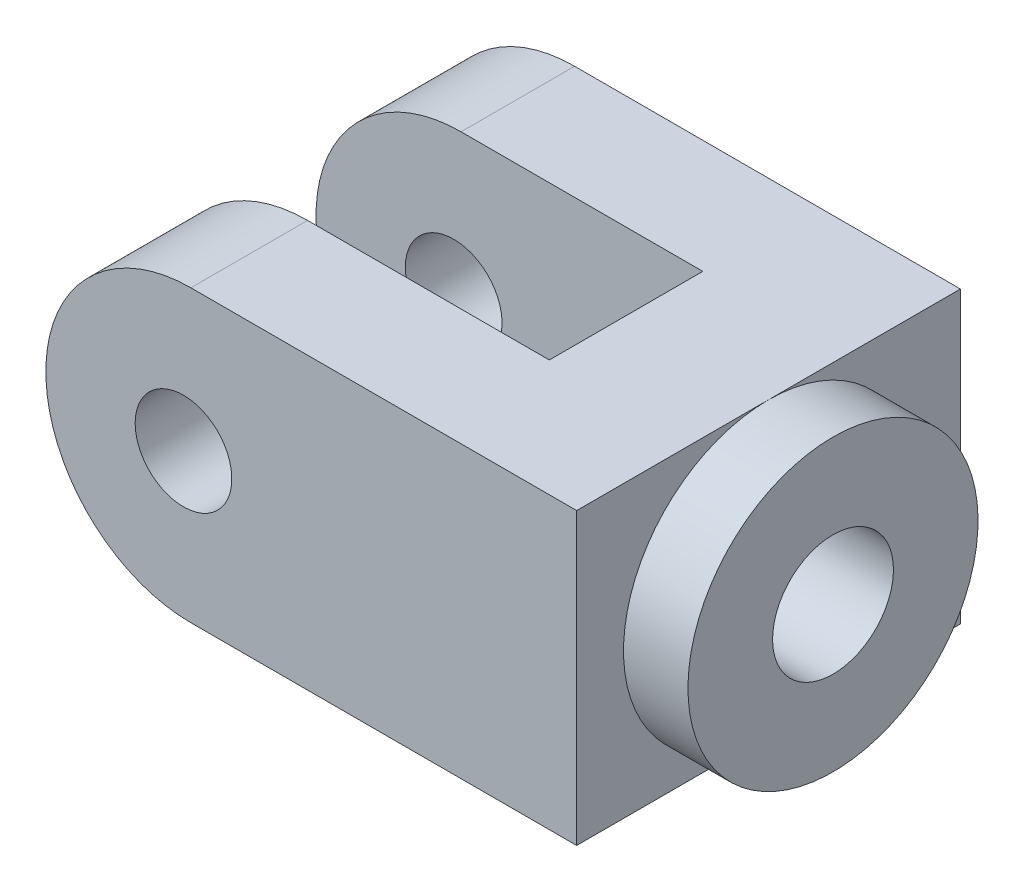
ISO-10303-21;
HEADER;
FILE_DESCRIPTION(('STEP AP214'),'2;1');
FILE_NAME('part.step','',(''),(''),'','','');
FILE_SCHEMA(('AUTOMOTIVE_DESIGN { 1 0 10303 214 1 1 1 1 }'));
ENDSEC;
DATA;
#1=APPLICATION_CONTEXT('core data for automotive mechanical design processes');
#2=APPLICATION_PROTOCOL_DEFINITION('international standard','automotive_design',2000,#1);
#3=PRODUCT_CONTEXT('',#1,'mechanical');
#4=PRODUCT('Part','Part','',(#3));
#5=PRODUCT_RELATED_PRODUCT_CATEGORY('part','',(#4));
#6=PRODUCT_DEFINITION_FORMATION('','',#4);
#7=PRODUCT_DEFINITION_CONTEXT('part definition',#1,'design');
#8=PRODUCT_DEFINITION('design','',#6,#7);
#9=PRODUCT_DEFINITION_SHAPE('','',#8);
#10=(LENGTH_UNIT() NAMED_UNIT(*) SI_UNIT(.MILLI.,.METRE.));
#11=(NAMED_UNIT(*) PLANE_ANGLE_UNIT() SI_UNIT($,.RADIAN.));
#12=(NAMED_UNIT(*) SI_UNIT($,.STERADIAN.) SOLID_ANGLE_UNIT());
#13=UNCERTAINTY_MEASURE_WITH_UNIT(LENGTH_MEASURE(1.E-05),#10,'distance_accuracy_value','');
#14=(GEOMETRIC_REPRESENTATION_CONTEXT(3) GLOBAL_UNCERTAINTY_ASSIGNED_CONTEXT((#13)) GLOBAL_UNIT_ASSIGNED_CONTEXT((#10,
#11,#12)) REPRESENTATION_CONTEXT('',''));
#15=CARTESIAN_POINT('',(0.,0.,0.));
#16=DIRECTION('',(0.,0.,1.));
#17=DIRECTION('',(1.,0.,0.));
#18=AXIS2_PLACEMENT_3D('',#15,#16,#17);
#19=CARTESIAN_POINT('',(66.0000000000003,35.9999999999998,47.6250000000002));
#20=DIRECTION('',(-0.999999999999999,0.,0.));
#21=DIRECTION('',(0.,-1.,0.));
#22=AXIS2_PLACEMENT_3D('',#19,#20,#21);
#23=PLANE('',#22);
#24=CARTESIAN_POINT('',(66.0000000000005,6.66133814775094E-13,2.66453525910038E-12));
#25=DIRECTION('',(0.999999999999999,0.,0.));
#26=DIRECTION('',(0.,1.,0.));
#27=AXIS2_PLACEMENT_3D('',#24,#25,#26);
#28=CIRCLE('',#27,36.);
#29=CARTESIAN_POINT('',(66.0000000000005,35.9999999999998,8.88178419700125E-13));
#30=VERTEX_POINT('',#29);
#31=CARTESIAN_POINT('',(66.0000000000005,-35.9999999999996,1.77635683940025E-12));
#32=VERTEX_POINT('',#31);
#33=EDGE_CURVE('E60',#30,#32,#28,.T.);
#34=ORIENTED_EDGE('',*,*,#33,.F.);
#35=DIRECTION('',(0.,0.,-1.));
#36=VECTOR('',#35,1.);
#37=CARTESIAN_POINT('',(66.0000000000003,35.9999999999998,47.6250000000002));
#38=LINE('',#37,#36);
#39=CARTESIAN_POINT('',(66.0000000000003,35.9999999999998,47.6250000000002));
#40=VERTEX_POINT('',#39);
#41=EDGE_CURVE('E122',#40,#30,#38,.T.);
#42=ORIENTED_EDGE('',*,*,#41,.F.);
#43=DIRECTION('',(0.,1.,0.));
#44=VECTOR('',#43,1.);
#45=CARTESIAN_POINT('',(66.0000000000003,35.9999999999998,47.6250000000002));
#46=LINE('',#45,#44);
#47=CARTESIAN_POINT('',(66.0000000000007,-35.9999999999998,47.6250000000018));
#48=VERTEX_POINT('',#47);
#49=EDGE_CURVE('E357',#48,#40,#46,.T.);
#50=ORIENTED_EDGE('',*,*,#49,.F.);
#51=DIRECTION('',(0.,0.,-1.));
#52=VECTOR('',#51,1.);
#53=CARTESIAN_POINT('',(66.0000000000007,-35.9999999999998,47.6250000000018));
#54=LINE('',#53,#52);
#55=EDGE_CURVE('E142',#48,#32,#54,.T.);
#56=ORIENTED_EDGE('',*,*,#55,.T.);
#57=EDGE_LOOP('',(#34,#42,#50,#56));
#58=FACE_BOUND('',#57,.T.);
#59=ADVANCED_FACE('F48',(#58),#23,.F.);
#60=CARTESIAN_POINT('',(-29.7628768845026,4.44089209850063E-13,389.175429799014));
#61=DIRECTION('',(0.,0.,-1.));
#62=DIRECTION('',(-0.999999999999999,0.,0.));
#63=AXIS2_PLACEMENT_3D('',#60,#61,#62);
#64=CYLINDRICAL_SURFACE('',#63,36.);
#65=DIRECTION('',(0.,0.,-1.));
#66=VECTOR('',#65,1.);
#67=CARTESIAN_POINT('',(-29.7628768845024,35.9999999999999,389.175429799013));
#68=LINE('',#67,#66);
#69=CARTESIAN_POINT('',(-29.7628768845022,36.0000000000005,47.6250000000022));
#70=VERTEX_POINT('',#69);
#71=CARTESIAN_POINT('',(-29.7628768845017,36.0000000000006,18.6550000000012));
#72=VERTEX_POINT('',#71);
#73=EDGE_CURVE('E351',#70,#72,#68,.T.);
#74=ORIENTED_EDGE('',*,*,#73,.T.);
#75=CARTESIAN_POINT('',(-29.762876884502,-2.22044604925031E-13,18.6550000000008));
#76=DIRECTION('',(0.,0.,1.));
#77=DIRECTION('',(0.999999999999999,0.,0.));
#78=AXIS2_PLACEMENT_3D('',#75,#76,#77);
#79=CIRCLE('',#78,36.);
#80=CARTESIAN_POINT('',(-29.762876884502,-35.9999999999995,18.6550000000012));
#81=VERTEX_POINT('',#80);
#82=EDGE_CURVE('E58',#72,#81,#79,.T.);
#83=ORIENTED_EDGE('',*,*,#82,.T.);
#84=DIRECTION('',(0.,0.,-1.));
#85=VECTOR('',#84,1.);
#86=CARTESIAN_POINT('',(-29.7628768845024,-35.9999999999999,389.175429799014));
#87=LINE('',#86,#85);
#88=CARTESIAN_POINT('',(-29.7628768845022,-35.9999999999997,47.6250000000029));
#89=VERTEX_POINT('',#88);
#90=EDGE_CURVE('E345',#89,#81,#87,.T.);
#91=ORIENTED_EDGE('',*,*,#90,.F.);
#92=CARTESIAN_POINT('',(-29.7628768845024,2.22044604925031E-13,47.6250000000014));
#93=DIRECTION('',(0.,0.,1.));
#94=DIRECTION('',(0.999999999999999,0.,0.));
#95=AXIS2_PLACEMENT_3D('',#92,#93,#94);
#96=CIRCLE('',#95,36.);
#97=EDGE_CURVE('E349',#89,#70,#96,.F.);
#98=ORIENTED_EDGE('',*,*,#97,.T.);
#99=EDGE_LOOP('',(#74,#83,#91,#98));
#100=FACE_BOUND('',#99,.T.);
#101=ADVANCED_FACE('F169',(#100),#64,.T.);
#102=CARTESIAN_POINT('',(-65.9999999999996,36.0000000000003,47.6250000000007));
#103=DIRECTION('',(0.,-1.,0.));
#104=DIRECTION('',(0.,0.,-1.));
#105=AXIS2_PLACEMENT_3D('',#102,#103,#104);
#106=PLANE('',#105);
#107=DIRECTION('',(0.,0.,1.));
#108=VECTOR('',#107,1.);
#109=CARTESIAN_POINT('',(30.2371231154974,35.9999999999996,18.6550000000003));
#110=LINE('',#109,#108);
#111=CARTESIAN_POINT('',(30.2371231154972,36.0000000000005,-19.4449999999988));
#112=VERTEX_POINT('',#111);
#113=CARTESIAN_POINT('',(30.2371231154974,35.9999999999996,18.6550000000003));
#114=VERTEX_POINT('',#113);
#115=EDGE_CURVE('E321',#112,#114,#110,.T.);
#116=ORIENTED_EDGE('',*,*,#115,.T.);
#117=DIRECTION('',(-0.999999999999999,0.,0.));
#118=VECTOR('',#117,1.);
#119=CARTESIAN_POINT('',(-65.7628768845024,35.9999999999998,18.6550000000003));
#120=LINE('',#119,#118);
#121=EDGE_CURVE('E325',#114,#72,#120,.T.);
#122=ORIENTED_EDGE('',*,*,#121,.T.);
#123=ORIENTED_EDGE('',*,*,#73,.F.);
#124=DIRECTION('',(-0.999999999999999,0.,0.));
#125=VECTOR('',#124,1.);
#126=CARTESIAN_POINT('',(-65.9999999999996,36.0000000000003,47.6250000000007));
#127=LINE('',#126,#125);
#128=EDGE_CURVE('E130',#40,#70,#127,.T.);
#129=ORIENTED_EDGE('',*,*,#128,.F.);
#130=ORIENTED_EDGE('',*,*,#41,.T.);
#131=CARTESIAN_POINT('',(66.0000000000001,36.0000000000005,-47.6249999999991));
#132=VERTEX_POINT('',#131);
#133=EDGE_CURVE('E126',#30,#132,#38,.T.);
#134=ORIENTED_EDGE('',*,*,#133,.T.);
#135=DIRECTION('',(-0.999999999999999,0.,0.));
#136=VECTOR('',#135,1.);
#137=CARTESIAN_POINT('',(-65.9999999999989,36.,-47.6249999999987));
#138=LINE('',#137,#136);
#139=CARTESIAN_POINT('',(-29.7628768845029,35.9999999999998,-47.6249999999987));
#140=VERTEX_POINT('',#139);
#141=EDGE_CURVE('E369',#132,#140,#138,.T.);
#142=ORIENTED_EDGE('',*,*,#141,.T.);
#143=CARTESIAN_POINT('',(-29.7628768845022,36.0000000000003,-19.4449999999984));
#144=VERTEX_POINT('',#143);
#145=EDGE_CURVE('E73',#144,#140,#68,.T.);
#146=ORIENTED_EDGE('',*,*,#145,.F.);
#147=DIRECTION('',(0.999999999999999,0.,0.));
#148=VECTOR('',#147,1.);
#149=CARTESIAN_POINT('',(-65.7628768845029,36.0000000000003,-19.4449999999979));
#150=LINE('',#149,#148);
#151=EDGE_CURVE('E317',#144,#112,#150,.T.);
#152=ORIENTED_EDGE('',*,*,#151,.T.);
#153=EDGE_LOOP('',(#116,#122,#123,#129,#130,#134,#142,#146,#152));
#154=FACE_BOUND('',#153,.T.);
#155=ADVANCED_FACE('F124',(#154),#106,.F.);
#156=CARTESIAN_POINT('',(2.22044604925031E-13,2.22044604925031E-13,47.6250000000011));
#157=DIRECTION('',(0.,0.,1.));
#158=DIRECTION('',(0.999999999999999,0.,0.));
#159=AXIS2_PLACEMENT_3D('',#156,#157,#158);
#160=PLANE('',#159);
#161=CARTESIAN_POINT('',(-31.5987267645179,4.44089209850063E-13,47.6250000000014));
#162=DIRECTION('',(0.,0.,-1.));
#163=DIRECTION('',(-0.999999999999999,0.,0.));
#164=AXIS2_PLACEMENT_3D('',#161,#162,#163);
#165=CIRCLE('',#164,12.);
#166=CARTESIAN_POINT('',(-43.5987267645179,4.56745752330789E-13,47.6250000000014));
#167=VERTEX_POINT('',#166);
#168=EDGE_CURVE('E297',#167,#167,#165,.T.);
#169=ORIENTED_EDGE('',*,*,#168,.T.);
#170=EDGE_LOOP('',(#169));
#171=FACE_BOUND('',#170,.T.);
#172=ORIENTED_EDGE('',*,*,#97,.F.);
#173=DIRECTION('',(0.999999999999999,0.,0.));
#174=VECTOR('',#173,1.);
#175=CARTESIAN_POINT('',(-65.9999999999985,-35.9999999999996,47.6250000000027));
#176=LINE('',#175,#174);
#177=EDGE_CURVE('E363',#89,#48,#176,.T.);
#178=ORIENTED_EDGE('',*,*,#177,.T.);
#179=ORIENTED_EDGE('',*,*,#49,.T.);
#180=ORIENTED_EDGE('',*,*,#128,.T.);
#181=EDGE_LOOP('',(#172,#178,#179,#180));
#182=FACE_BOUND('',#181,.T.);
#183=ADVANCED_FACE('F185',(#171,#182),#160,.T.);
#184=CARTESIAN_POINT('',(8.88178419700125E-13,6.66133814775094E-13,-47.6249999999983));
#185=DIRECTION('',(0.,0.,1.));
#186=DIRECTION('',(0.999999999999999,0.,0.));
#187=AXIS2_PLACEMENT_3D('',#184,#185,#186);
#188=PLANE('',#187);
#189=CARTESIAN_POINT('',(-31.5987267645179,8.88178419700125E-13,-47.6249999999974));
#190=DIRECTION('',(0.,0.,-1.));
#191=DIRECTION('',(-0.999999999999999,0.,0.));
#192=AXIS2_PLACEMENT_3D('',#189,#190,#191);
#193=CIRCLE('',#192,12.);
#194=CARTESIAN_POINT('',(-43.5987267645179,9.00834962180852E-13,-47.6249999999974));
#195=VERTEX_POINT('',#194);
#196=EDGE_CURVE('E310',#195,#195,#193,.T.);
#197=ORIENTED_EDGE('',*,*,#196,.F.);
#198=EDGE_LOOP('',(#197));
#199=FACE_BOUND('',#198,.T.);
#200=DIRECTION('',(0.999999999999999,0.,0.));
#201=VECTOR('',#200,1.);
#202=CARTESIAN_POINT('',(-65.9999999999989,-35.9999999999994,-47.6249999999991));
#203=LINE('',#202,#201);
#204=CARTESIAN_POINT('',(-29.7628768845029,-36.,-47.625));
#205=VERTEX_POINT('',#204);
#206=CARTESIAN_POINT('',(66.0000000000012,-35.9999999999998,-47.6249999999991));
#207=VERTEX_POINT('',#206);
#208=EDGE_CURVE('E360',#205,#207,#203,.T.);
#209=ORIENTED_EDGE('',*,*,#208,.F.);
#210=CARTESIAN_POINT('',(-29.7628768845026,1.11022302462516E-13,-47.6249999999978));
#211=DIRECTION('',(0.,0.,1.));
#212=DIRECTION('',(0.999999999999999,0.,0.));
#213=AXIS2_PLACEMENT_3D('',#210,#211,#212);
#214=CIRCLE('',#213,36.);
#215=EDGE_CURVE('E136',#205,#140,#214,.F.);
#216=ORIENTED_EDGE('',*,*,#215,.T.);
#217=ORIENTED_EDGE('',*,*,#141,.F.);
#218=DIRECTION('',(0.,1.,0.));
#219=VECTOR('',#218,1.);
#220=CARTESIAN_POINT('',(66.0000000000001,36.0000000000005,-47.6249999999991));
#221=LINE('',#220,#219);
#222=EDGE_CURVE('E140',#207,#132,#221,.T.);
#223=ORIENTED_EDGE('',*,*,#222,.F.);
#224=EDGE_LOOP('',(#209,#216,#217,#223));
#225=FACE_BOUND('',#224,.T.);
#226=ADVANCED_FACE('F178',(#199,#225),#188,.F.);
#227=EDGE_CURVE('E13',#32,#30,#28,.T.);
#228=ORIENTED_EDGE('',*,*,#227,.F.);
#229=EDGE_CURVE('E366',#32,#207,#54,.T.);
#230=ORIENTED_EDGE('',*,*,#229,.T.);
#231=ORIENTED_EDGE('',*,*,#222,.T.);
#232=ORIENTED_EDGE('',*,*,#133,.F.);
#233=EDGE_LOOP('',(#228,#230,#231,#232));
#234=FACE_BOUND('',#233,.T.);
#235=ADVANCED_FACE('F50',(#234),#23,.F.);
#236=CARTESIAN_POINT('',(-65.9999999999985,-35.9999999999996,47.6250000000027));
#237=DIRECTION('',(0.,1.,0.));
#238=DIRECTION('',(0.,0.,1.));
#239=AXIS2_PLACEMENT_3D('',#236,#237,#238);
#240=PLANE('',#239);
#241=ORIENTED_EDGE('',*,*,#90,.T.);
#242=DIRECTION('',(-0.999999999999999,0.,0.));
#243=VECTOR('',#242,1.);
#244=CARTESIAN_POINT('',(-65.762876884502,-36.,18.6550000000025));
#245=LINE('',#244,#243);
#246=CARTESIAN_POINT('',(30.2371231154979,-35.9999999999993,18.6550000000016));
#247=VERTEX_POINT('',#246);
#248=EDGE_CURVE('E322',#247,#81,#245,.T.);
#249=ORIENTED_EDGE('',*,*,#248,.F.);
#250=DIRECTION('',(0.,0.,1.));
#251=VECTOR('',#250,1.);
#252=CARTESIAN_POINT('',(30.2371231154979,-35.9999999999993,18.6550000000016));
#253=LINE('',#252,#251);
#254=CARTESIAN_POINT('',(30.2371231154985,-35.9999999999999,-19.4449999999975));
#255=VERTEX_POINT('',#254);
#256=EDGE_CURVE('E333',#255,#247,#253,.T.);
#257=ORIENTED_EDGE('',*,*,#256,.F.);
#258=DIRECTION('',(0.999999999999999,0.,0.));
#259=VECTOR('',#258,1.);
#260=CARTESIAN_POINT('',(-65.7628768845024,-35.9999999999996,-19.4449999999997));
#261=LINE('',#260,#259);
#262=CARTESIAN_POINT('',(-29.762876884502,-35.9999999999993,-19.4449999999975));
#263=VERTEX_POINT('',#262);
#264=EDGE_CURVE('E330',#263,#255,#261,.T.);
#265=ORIENTED_EDGE('',*,*,#264,.F.);
#266=EDGE_CURVE('E350',#263,#205,#87,.T.);
#267=ORIENTED_EDGE('',*,*,#266,.T.);
#268=ORIENTED_EDGE('',*,*,#208,.T.);
#269=ORIENTED_EDGE('',*,*,#229,.F.);
#270=ORIENTED_EDGE('',*,*,#55,.F.);
#271=ORIENTED_EDGE('',*,*,#177,.F.);
#272=EDGE_LOOP('',(#241,#249,#257,#265,#267,#268,#269,#270,#271));
#273=FACE_BOUND('',#272,.T.);
#274=ADVANCED_FACE('F177',(#273),#240,.F.);
#275=CARTESIAN_POINT('',(-29.7628768845024,2.22044604925031E-13,-19.444999999997));
#276=DIRECTION('',(0.,0.,-1.));
#277=DIRECTION('',(-0.999999999999999,0.,0.));
#278=AXIS2_PLACEMENT_3D('',#275,#276,#277);
#279=CIRCLE('',#278,36.);
#280=EDGE_CURVE('E379',#263,#144,#279,.T.);
#281=ORIENTED_EDGE('',*,*,#280,.T.);
#282=ORIENTED_EDGE('',*,*,#145,.T.);
#283=ORIENTED_EDGE('',*,*,#215,.F.);
#284=ORIENTED_EDGE('',*,*,#266,.F.);
#285=EDGE_LOOP('',(#281,#282,#283,#284));
#286=FACE_BOUND('',#285,.T.);
#287=ADVANCED_FACE('F175',(#286),#64,.T.);
#288=CARTESIAN_POINT('',(-65.7628768845024,35.9999999999998,18.6550000000003));
#289=DIRECTION('',(0.,0.,1.));
#290=DIRECTION('',(0.999999999999999,0.,0.));
#291=AXIS2_PLACEMENT_3D('',#288,#289,#290);
#292=PLANE('',#291);
#293=CARTESIAN_POINT('',(-31.5987267645188,2.22044604925031E-13,18.6550000000016));
#294=DIRECTION('',(0.,0.,1.));
#295=DIRECTION('',(0.999999999999999,0.,0.));
#296=AXIS2_PLACEMENT_3D('',#293,#294,#295);
#297=CIRCLE('',#296,12.);
#298=CARTESIAN_POINT('',(-19.5987267645188,2.09388062444305E-13,18.6550000000016));
#299=VERTEX_POINT('',#298);
#300=EDGE_CURVE('E300',#299,#299,#297,.T.);
#301=ORIENTED_EDGE('',*,*,#300,.T.);
#302=EDGE_LOOP('',(#301));
#303=FACE_BOUND('',#302,.T.);
#304=ORIENTED_EDGE('',*,*,#121,.F.);
#305=DIRECTION('',(0.,-1.,0.));
#306=VECTOR('',#305,1.);
#307=CARTESIAN_POINT('',(30.2371231154974,35.9999999999996,18.6550000000003));
#308=LINE('',#307,#306);
#309=EDGE_CURVE('E339',#114,#247,#308,.T.);
#310=ORIENTED_EDGE('',*,*,#309,.T.);
#311=ORIENTED_EDGE('',*,*,#248,.T.);
#312=ORIENTED_EDGE('',*,*,#82,.F.);
#313=EDGE_LOOP('',(#304,#310,#311,#312));
#314=FACE_BOUND('',#313,.T.);
#315=ADVANCED_FACE('F227',(#303,#314),#292,.F.);
#316=CARTESIAN_POINT('',(-65.7628768845029,36.0000000000003,-19.4449999999979));
#317=DIRECTION('',(0.,0.,-1.));
#318=DIRECTION('',(-0.999999999999999,0.,0.));
#319=AXIS2_PLACEMENT_3D('',#316,#317,#318);
#320=PLANE('',#319);
#321=CARTESIAN_POINT('',(-31.5987267645179,8.88178419700125E-13,-19.4449999999997));
#322=DIRECTION('',(0.,0.,-1.));
#323=DIRECTION('',(-0.999999999999999,0.,0.));
#324=AXIS2_PLACEMENT_3D('',#321,#322,#323);
#325=CIRCLE('',#324,12.);
#326=CARTESIAN_POINT('',(-43.5987267645179,9.00834962180852E-13,-19.4449999999997));
#327=VERTEX_POINT('',#326);
#328=EDGE_CURVE('E52',#327,#327,#325,.T.);
#329=ORIENTED_EDGE('',*,*,#328,.T.);
#330=EDGE_LOOP('',(#329));
#331=FACE_BOUND('',#330,.T.);
#332=ORIENTED_EDGE('',*,*,#280,.F.);
#333=ORIENTED_EDGE('',*,*,#264,.T.);
#334=DIRECTION('',(0.,-1.,0.));
#335=VECTOR('',#334,1.);
#336=CARTESIAN_POINT('',(30.2371231154972,36.0000000000005,-19.4449999999988));
#337=LINE('',#336,#335);
#338=EDGE_CURVE('E329',#112,#255,#337,.T.);
#339=ORIENTED_EDGE('',*,*,#338,.F.);
#340=ORIENTED_EDGE('',*,*,#151,.F.);
#341=EDGE_LOOP('',(#332,#333,#339,#340));
#342=FACE_BOUND('',#341,.T.);
#343=ADVANCED_FACE('F236',(#331,#342),#320,.F.);
#344=CARTESIAN_POINT('',(30.2371231154974,35.9999999999996,18.6550000000003));
#345=DIRECTION('',(0.999999999999999,0.,0.));
#346=DIRECTION('',(0.,0.,-1.));
#347=AXIS2_PLACEMENT_3D('',#344,#345,#346);
#348=PLANE('',#347);
#349=CARTESIAN_POINT('',(30.2371231154976,2.22044604925031E-13,0.));
#350=DIRECTION('',(0.999999999999999,0.,0.));
#351=DIRECTION('',(0.,0.,-1.));
#352=AXIS2_PLACEMENT_3D('',#349,#350,#351);
#353=CIRCLE('',#352,15.);
#354=CARTESIAN_POINT('',(30.2371231154977,15.0000000000007,1.70624625539517E-12));
#355=VERTEX_POINT('',#354);
#356=EDGE_CURVE('E315',#355,#355,#353,.T.);
#357=ORIENTED_EDGE('',*,*,#356,.T.);
#358=EDGE_LOOP('',(#357));
#359=FACE_BOUND('',#358,.T.);
#360=ORIENTED_EDGE('',*,*,#256,.T.);
#361=ORIENTED_EDGE('',*,*,#309,.F.);
#362=ORIENTED_EDGE('',*,*,#115,.F.);
#363=ORIENTED_EDGE('',*,*,#338,.T.);
#364=EDGE_LOOP('',(#360,#361,#362,#363));
#365=FACE_BOUND('',#364,.T.);
#366=ADVANCED_FACE('F246',(#359,#365),#348,.F.);
#367=CARTESIAN_POINT('',(-65.7628768845022,7.7715611723761E-13,1.77635683940025E-12));
#368=DIRECTION('',(0.999999999999999,0.,0.));
#369=DIRECTION('',(0.,1.,0.));
#370=AXIS2_PLACEMENT_3D('',#367,#368,#369);
#371=CYLINDRICAL_SURFACE('',#370,15.);
#372=CARTESIAN_POINT('',(82.0000000000007,4.44089209850063E-13,4.44089209850063E-13));
#373=DIRECTION('',(0.999999999999999,0.,0.));
#374=DIRECTION('',(0.,1.,0.));
#375=AXIS2_PLACEMENT_3D('',#372,#373,#374);
#376=CIRCLE('',#375,15.);
#377=CARTESIAN_POINT('',(82.0000000000008,15.0000000000006,1.67607537808272E-12));
#378=VERTEX_POINT('',#377);
#379=EDGE_CURVE('E149',#378,#378,#376,.T.);
#380=CARTESIAN_POINT('',(30.2371231154977,15.0000000000007,1.70624625539517E-12));
#381=CARTESIAN_POINT('',(30.7763197497112,15.0000000000007,1.70593197542317E-12));
#382=CARTESIAN_POINT('',(31.3155163839248,15.0000000000007,1.70561769545116E-12));
#383=CARTESIAN_POINT('',(32.393909652352,15.0000000000007,1.70498913550715E-12));
#384=CARTESIAN_POINT('',(32.9331062865655,15.0000000000006,1.70467485553515E-12));
#385=CARTESIAN_POINT('',(34.0114995549927,15.0000000000006,1.70404629559114E-12));
#386=CARTESIAN_POINT('',(34.5506961892063,15.0000000000006,1.70373201561913E-12));
#387=CARTESIAN_POINT('',(35.6290894576334,15.0000000000006,1.70310345567512E-12));
#388=CARTESIAN_POINT('',(36.168286091847,15.0000000000006,1.70278917570312E-12));
#389=CARTESIAN_POINT('',(37.2466793602741,15.0000000000006,1.70216061575911E-12));
#390=CARTESIAN_POINT('',(37.7858759944877,15.0000000000006,1.70184633578711E-12));
#391=CARTESIAN_POINT('',(38.8642692629149,15.0000000000006,1.7012177758431E-12));
#392=CARTESIAN_POINT('',(39.4034658971284,15.0000000000006,1.70090349587109E-12));
#393=CARTESIAN_POINT('',(40.4818591655556,15.0000000000006,1.70027493592708E-12));
#394=CARTESIAN_POINT('',(41.0210557997692,15.0000000000006,1.69996065595508E-12));
#395=CARTESIAN_POINT('',(42.0994490681963,15.0000000000006,1.69933209601107E-12));
#396=CARTESIAN_POINT('',(42.6386457024099,15.0000000000006,1.69901781603906E-12));
#397=CARTESIAN_POINT('',(43.717038970837,15.0000000000006,1.69838925609505E-12));
#398=CARTESIAN_POINT('',(44.2562356050506,15.0000000000006,1.69807497612305E-12));
#399=CARTESIAN_POINT('',(45.3346288734777,15.0000000000006,1.69744641617904E-12));
#400=CARTESIAN_POINT('',(45.8738255076913,15.0000000000006,1.69713213620703E-12));
#401=CARTESIAN_POINT('',(46.9522187761185,15.0000000000006,1.69650357626302E-12));
#402=CARTESIAN_POINT('',(47.491415410332,15.0000000000006,1.69618929629102E-12));
#403=CARTESIAN_POINT('',(48.5698086787592,15.0000000000006,1.69556073634701E-12));
#404=CARTESIAN_POINT('',(49.1090053129728,15.0000000000006,1.69524645637501E-12));
#405=CARTESIAN_POINT('',(50.1873985813999,15.0000000000006,1.694617896431E-12));
#406=CARTESIAN_POINT('',(50.7265952156135,15.0000000000006,1.69430361645899E-12));
#407=CARTESIAN_POINT('',(51.8049884840406,15.0000000000006,1.69367505651498E-12));
#408=CARTESIAN_POINT('',(52.3441851182542,15.0000000000006,1.69336077654298E-12));
#409=CARTESIAN_POINT('',(53.4225783866814,15.0000000000006,1.69273221659897E-12));
#410=CARTESIAN_POINT('',(53.9617750208949,15.0000000000006,1.69241793662696E-12));
#411=CARTESIAN_POINT('',(55.0401682893221,15.0000000000006,1.69178937668295E-12));
#412=CARTESIAN_POINT('',(55.5793649235356,15.0000000000006,1.69147509671095E-12));
#413=CARTESIAN_POINT('',(56.6577581919628,15.0000000000006,1.69084653676694E-12));
#414=CARTESIAN_POINT('',(57.1969548261764,15.0000000000006,1.69053225679493E-12));
#415=CARTESIAN_POINT('',(58.2753480946035,15.0000000000006,1.68990369685092E-12));
#416=CARTESIAN_POINT('',(58.8145447288171,15.0000000000006,1.68958941687892E-12));
#417=CARTESIAN_POINT('',(59.8929379972442,15.0000000000006,1.68896085693491E-12));
#418=CARTESIAN_POINT('',(60.4321346314578,15.0000000000006,1.68864657696291E-12));
#419=CARTESIAN_POINT('',(61.510527899885,15.0000000000006,1.6880180170189E-12));
#420=CARTESIAN_POINT('',(62.0497245340986,15.0000000000006,1.68770373704689E-12));
#421=CARTESIAN_POINT('',(63.1281178025257,15.0000000000006,1.68707517710288E-12));
#422=CARTESIAN_POINT('',(63.6673144367393,15.0000000000006,1.68676089713088E-12));
#423=CARTESIAN_POINT('',(64.7457077051664,15.0000000000006,1.68613233718687E-12));
#424=CARTESIAN_POINT('',(65.28490433938,15.0000000000006,1.68581805721486E-12));
#425=CARTESIAN_POINT('',(66.3632976078071,15.0000000000006,1.68518949727085E-12));
#426=CARTESIAN_POINT('',(66.9024942420207,15.0000000000006,1.68487521729885E-12));
#427=CARTESIAN_POINT('',(67.9808875104479,15.0000000000006,1.68424665735484E-12));
#428=CARTESIAN_POINT('',(68.5200841446614,15.0000000000006,1.68393237738283E-12));
#429=CARTESIAN_POINT('',(69.5984774130886,15.0000000000006,1.68330381743882E-12));
#430=CARTESIAN_POINT('',(70.1376740473022,15.0000000000006,1.68298953746682E-12));
#431=CARTESIAN_POINT('',(71.2160673157293,15.0000000000006,1.68236097752281E-12));
#432=CARTESIAN_POINT('',(71.7552639499429,15.0000000000006,1.68204669755081E-12));
#433=CARTESIAN_POINT('',(72.83365721837,15.0000000000006,1.6814181376068E-12));
#434=CARTESIAN_POINT('',(73.3728538525836,15.0000000000006,1.68110385763479E-12));
#435=CARTESIAN_POINT('',(74.4512471210107,15.0000000000006,1.68047529769078E-12));
#436=CARTESIAN_POINT('',(74.9904437552243,15.0000000000006,1.68016101771878E-12));
#437=CARTESIAN_POINT('',(76.0688370236514,15.0000000000006,1.67953245777477E-12));
#438=CARTESIAN_POINT('',(76.608033657865,15.0000000000006,1.67921817780276E-12));
#439=CARTESIAN_POINT('',(77.6864269262922,15.0000000000006,1.67858961785875E-12));
#440=CARTESIAN_POINT('',(78.2256235605058,15.0000000000006,1.67827533788675E-12));
#441=CARTESIAN_POINT('',(79.3040168289329,15.0000000000006,1.67764677794274E-12));
#442=CARTESIAN_POINT('',(79.8432134631465,15.0000000000006,1.67733249797073E-12));
#443=CARTESIAN_POINT('',(80.9216067315736,15.0000000000006,1.67670393802672E-12));
#444=CARTESIAN_POINT('',(81.4608033657872,15.0000000000006,1.67638965805472E-12));
#445=CARTESIAN_POINT('',(82.0000000000008,15.0000000000006,1.67607537808272E-12));
#446=B_SPLINE_CURVE_WITH_KNOTS('',3,(#380,#381,#382,#383,#384,#385,#386,#387,#388,#389,#390,
#391,#392,#393,#394,#395,#396,#397,#398,#399,#400,#401,#402,#403,#404,#405,#406,#407,#408,#409,
#410,#411,#412,#413,#414,#415,#416,#417,#418,#419,#420,#421,#422,#423,#424,#425,#426,#427,#428,
#429,#430,#431,#432,#433,#434,#435,#436,#437,#438,#439,#440,#441,#442,#443,#444,#445),
.UNSPECIFIED.,.F.,.F.,(4,2,2,2,2,2,2,2,2,2,2,2,2,2,2,2,2,2,2,2,2,2,2,2,2,2,2,2,2,2,2,2,4),(0.,
1.61758990264073,3.23517980528144,4.85276970792217,6.4703596105629,8.08794951320363,
9.70553941584434,11.3231293184851,12.9407192211258,14.5583091237665,16.1758990264072,
17.793488929048,19.4110788316887,21.0286687343294,22.6462586369701,24.2638485396108,
25.8814384422516,27.4990283448923,29.116618247533,30.7342081501737,32.3517980528145,
33.9693879554552,35.5869778580959,37.2045677607366,38.8221576633773,40.4397475660181,
42.0573374686588,43.6749273712995,45.2925172739402,46.910107176581,48.5276970792217,
50.1452869818624,51.7628768845031),.UNSPECIFIED.);
#447=EDGE_CURVE('BSEAM163',#355,#378,#446,.T.);
#448=ORIENTED_EDGE('',*,*,#356,.F.);
#449=ORIENTED_EDGE('',*,*,#379,.T.);
#450=ORIENTED_EDGE('',*,*,#447,.T.);
#451=ORIENTED_EDGE('',*,*,#447,.F.);
#452=EDGE_LOOP('',(#448,#450,#449,#451));
#453=FACE_BOUND('',#452,.T.);
#454=ADVANCED_FACE('F163',(#453),#371,.F.);
#455=CARTESIAN_POINT('',(82.0000000000007,4.44089209850063E-13,4.44089209850063E-13));
#456=DIRECTION('',(0.999999999999999,0.,0.));
#457=DIRECTION('',(0.,1.,0.));
#458=AXIS2_PLACEMENT_3D('',#455,#456,#457);
#459=PLANE('',#458);
#460=CARTESIAN_POINT('',(82.0000000000007,4.44089209850063E-13,4.44089209850063E-13));
#461=DIRECTION('',(0.999999999999999,0.,0.));
#462=DIRECTION('',(0.,1.,0.));
#463=AXIS2_PLACEMENT_3D('',#460,#461,#462);
#464=CIRCLE('',#463,36.);
#465=CARTESIAN_POINT('',(82.0000000000007,36.0000000000004,4.10116385296533E-13));
#466=VERTEX_POINT('',#465);
#467=EDGE_CURVE('E148',#466,#466,#464,.T.);
#468=ORIENTED_EDGE('',*,*,#467,.T.);
#469=EDGE_LOOP('',(#468));
#470=FACE_BOUND('',#469,.T.);
#471=ORIENTED_EDGE('',*,*,#379,.F.);
#472=EDGE_LOOP('',(#471));
#473=FACE_BOUND('',#472,.T.);
#474=ADVANCED_FACE('F153',(#470,#473),#459,.T.);
#475=CARTESIAN_POINT('',(82.0000000000007,4.44089209850063E-13,4.44089209850063E-13));
#476=DIRECTION('',(-0.999999999999999,0.,0.));
#477=DIRECTION('',(0.,-1.,0.));
#478=AXIS2_PLACEMENT_3D('',#475,#476,#477);
#479=CYLINDRICAL_SURFACE('',#478,36.);
#480=ORIENTED_EDGE('',*,*,#467,.F.);
#481=EDGE_LOOP('',(#480));
#482=FACE_BOUND('',#481,.T.);
#483=ORIENTED_EDGE('',*,*,#33,.T.);
#484=ORIENTED_EDGE('',*,*,#227,.T.);
#485=EDGE_LOOP('',(#483,#484));
#486=FACE_BOUND('',#485,.T.);
#487=ADVANCED_FACE('F150',(#482,#486),#479,.T.);
#488=CARTESIAN_POINT('',(-31.5987267645179,4.44089209850063E-13,47.6250000000014));
#489=DIRECTION('',(0.,0.,-1.));
#490=DIRECTION('',(-0.999999999999999,0.,0.));
#491=AXIS2_PLACEMENT_3D('',#488,#489,#490);
#492=CYLINDRICAL_SURFACE('',#491,12.);
#493=ORIENTED_EDGE('',*,*,#196,.T.);
#494=EDGE_LOOP('',(#493));
#495=FACE_BOUND('',#494,.T.);
#496=ORIENTED_EDGE('',*,*,#328,.F.);
#497=EDGE_LOOP('',(#496));
#498=FACE_BOUND('',#497,.T.);
#499=ADVANCED_FACE('F152',(#495,#498),#492,.F.);
#500=ORIENTED_EDGE('',*,*,#168,.F.);
#501=EDGE_LOOP('',(#500));
#502=FACE_BOUND('',#501,.T.);
#503=ORIENTED_EDGE('',*,*,#300,.F.);
#504=EDGE_LOOP('',(#503));
#505=FACE_BOUND('',#504,.T.);
#506=ADVANCED_FACE('F160',(#502,#505),#492,.F.);
#507=CLOSED_SHELL('',(#59,#101,#155,#183,#226,#235,#274,#287,#315,#343,#366,#454,#474,#487,#499,#506));
#508=MANIFOLD_SOLID_BREP('B2',#507);
#509=ADVANCED_BREP_SHAPE_REPRESENTATION('',(#18,#508),#14);
#510=SHAPE_DEFINITION_REPRESENTATION(#9,#509);
ENDSEC;
END-ISO-10303-21;
